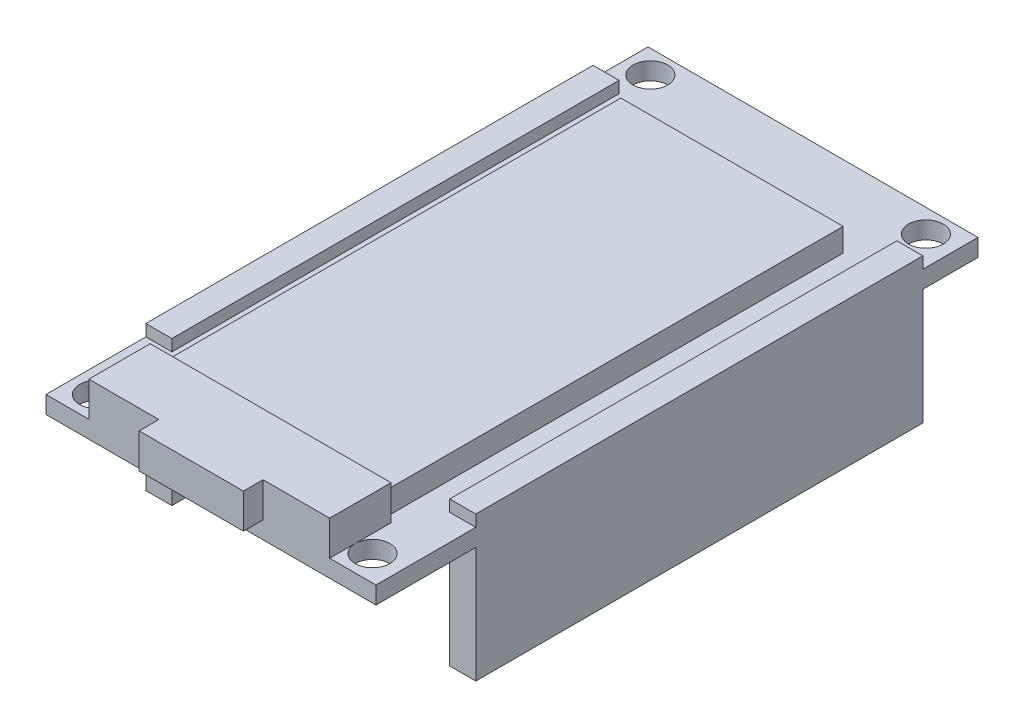
ISO-10303-21;
HEADER;
FILE_DESCRIPTION(('STEP AP214'),'2;1');
FILE_NAME('part.step','',(''),(''),'','','');
FILE_SCHEMA(('AUTOMOTIVE_DESIGN { 1 0 10303 214 1 1 1 1 }'));
ENDSEC;
DATA;
#1=APPLICATION_CONTEXT('core data for automotive mechanical design processes');
#2=APPLICATION_PROTOCOL_DEFINITION('international standard','automotive_design',2000,#1);
#3=PRODUCT_CONTEXT('',#1,'mechanical');
#4=PRODUCT('Part','Part','',(#3));
#5=PRODUCT_RELATED_PRODUCT_CATEGORY('part','',(#4));
#6=PRODUCT_DEFINITION_FORMATION('','',#4);
#7=PRODUCT_DEFINITION_CONTEXT('part definition',#1,'design');
#8=PRODUCT_DEFINITION('design','',#6,#7);
#9=PRODUCT_DEFINITION_SHAPE('','',#8);
#10=(LENGTH_UNIT() NAMED_UNIT(*) SI_UNIT(.MILLI.,.METRE.));
#11=(NAMED_UNIT(*) PLANE_ANGLE_UNIT() SI_UNIT($,.RADIAN.));
#12=(NAMED_UNIT(*) SI_UNIT($,.STERADIAN.) SOLID_ANGLE_UNIT());
#13=UNCERTAINTY_MEASURE_WITH_UNIT(LENGTH_MEASURE(1.E-05),#10,'distance_accuracy_value','');
#14=(GEOMETRIC_REPRESENTATION_CONTEXT(3) GLOBAL_UNCERTAINTY_ASSIGNED_CONTEXT((#13)) GLOBAL_UNIT_ASSIGNED_CONTEXT((#10,
#11,#12)) REPRESENTATION_CONTEXT('',''));
#15=CARTESIAN_POINT('',(0.,0.,0.));
#16=DIRECTION('',(0.,0.,1.));
#17=DIRECTION('',(1.,0.,0.));
#18=AXIS2_PLACEMENT_3D('',#15,#16,#17);
#19=CARTESIAN_POINT('',(0.,1.5,0.));
#20=DIRECTION('',(0.,1.,0.));
#21=DIRECTION('',(0.,0.,1.));
#22=AXIS2_PLACEMENT_3D('',#19,#20,#21);
#23=PLANE('',#22);
#24=DIRECTION('',(-1.,0.,0.));
#25=VECTOR('',#24,1.);
#26=CARTESIAN_POINT('',(2.25,1.5,43.3778084250648));
#27=LINE('',#26,#25);
#28=CARTESIAN_POINT('',(2.25,1.5,43.3778084250648));
#29=VERTEX_POINT('',#28);
#30=CARTESIAN_POINT('',(0.,1.5,43.3778084250648));
#31=VERTEX_POINT('',#30);
#32=EDGE_CURVE('E370',#29,#31,#27,.T.);
#33=ORIENTED_EDGE('',*,*,#32,.T.);
#34=DIRECTION('',(0.,0.,1.));
#35=VECTOR('',#34,1.);
#36=CARTESIAN_POINT('',(0.,1.5,0.));
#37=LINE('',#36,#35);
#38=CARTESIAN_POINT('',(0.,1.5,52.));
#39=VERTEX_POINT('',#38);
#40=EDGE_CURVE('E518',#31,#39,#37,.T.);
#41=ORIENTED_EDGE('',*,*,#40,.T.);
#42=DIRECTION('',(1.,0.,0.));
#43=VECTOR('',#42,1.);
#44=CARTESIAN_POINT('',(0.,1.5,52.));
#45=LINE('',#44,#43);
#46=CARTESIAN_POINT('',(3.7,1.5,52.));
#47=VERTEX_POINT('',#46);
#48=EDGE_CURVE('E533',#39,#47,#45,.T.);
#49=ORIENTED_EDGE('',*,*,#48,.T.);
#50=DIRECTION('',(0.,0.,1.));
#51=VECTOR('',#50,1.);
#52=CARTESIAN_POINT('',(3.7,1.5,46.7));
#53=LINE('',#52,#51);
#54=CARTESIAN_POINT('',(3.7,1.5,49.8));
#55=VERTEX_POINT('',#54);
#56=EDGE_CURVE('E453',#55,#47,#53,.T.);
#57=ORIENTED_EDGE('',*,*,#56,.F.);
#58=CARTESIAN_POINT('',(2.2,1.5,49.8));
#59=DIRECTION('',(0.,1.,0.));
#60=DIRECTION('',(0.,0.,-1.));
#61=AXIS2_PLACEMENT_3D('',#58,#59,#60);
#62=CIRCLE('',#61,1.5);
#63=EDGE_CURVE('E556',#55,#55,#62,.T.);
#64=ORIENTED_EDGE('',*,*,#63,.F.);
#65=CARTESIAN_POINT('',(3.7,1.5,46.7));
#66=VERTEX_POINT('',#65);
#67=EDGE_CURVE('E450',#66,#55,#53,.T.);
#68=ORIENTED_EDGE('',*,*,#67,.F.);
#69=DIRECTION('',(1.,0.,0.));
#70=VECTOR('',#69,1.);
#71=CARTESIAN_POINT('',(9.75,1.5,46.7));
#72=LINE('',#71,#70);
#73=CARTESIAN_POINT('',(4.65,1.5,46.7));
#74=VERTEX_POINT('',#73);
#75=EDGE_CURVE('E482',#66,#74,#72,.T.);
#76=ORIENTED_EDGE('',*,*,#75,.T.);
#77=DIRECTION('',(0.,0.,-1.));
#78=VECTOR('',#77,1.);
#79=CARTESIAN_POINT('',(4.65,1.5,46.7));
#80=LINE('',#79,#78);
#81=CARTESIAN_POINT('',(4.65,1.5,7.));
#82=VERTEX_POINT('',#81);
#83=EDGE_CURVE('E428',#74,#82,#80,.T.);
#84=ORIENTED_EDGE('',*,*,#83,.T.);
#85=DIRECTION('',(1.,0.,0.));
#86=VECTOR('',#85,1.);
#87=CARTESIAN_POINT('',(4.65,1.5,7.));
#88=LINE('',#87,#86);
#89=CARTESIAN_POINT('',(23.85,1.5,7.));
#90=VERTEX_POINT('',#89);
#91=EDGE_CURVE('E418',#82,#90,#88,.T.);
#92=ORIENTED_EDGE('',*,*,#91,.T.);
#93=DIRECTION('',(0.,0.,1.));
#94=VECTOR('',#93,1.);
#95=CARTESIAN_POINT('',(23.85,1.5,7.));
#96=LINE('',#95,#94);
#97=CARTESIAN_POINT('',(23.85,1.5,46.7));
#98=VERTEX_POINT('',#97);
#99=EDGE_CURVE('E413',#90,#98,#96,.T.);
#100=ORIENTED_EDGE('',*,*,#99,.T.);
#101=CARTESIAN_POINT('',(24.5,1.5,46.7));
#102=VERTEX_POINT('',#101);
#103=EDGE_CURVE('E486',#98,#102,#72,.T.);
#104=ORIENTED_EDGE('',*,*,#103,.T.);
#105=DIRECTION('',(0.,0.,-1.));
#106=VECTOR('',#105,1.);
#107=CARTESIAN_POINT('',(24.5,1.5,52.));
#108=LINE('',#107,#106);
#109=CARTESIAN_POINT('',(24.5,1.5,49.8));
#110=VERTEX_POINT('',#109);
#111=EDGE_CURVE('E452',#110,#102,#108,.T.);
#112=ORIENTED_EDGE('',*,*,#111,.F.);
#113=CARTESIAN_POINT('',(26.,1.5,49.8));
#114=DIRECTION('',(0.,1.,0.));
#115=DIRECTION('',(0.,0.,1.));
#116=AXIS2_PLACEMENT_3D('',#113,#114,#115);
#117=CIRCLE('',#116,1.5);
#118=EDGE_CURVE('E544',#110,#110,#117,.T.);
#119=ORIENTED_EDGE('',*,*,#118,.F.);
#120=CARTESIAN_POINT('',(24.5,1.5,52.));
#121=VERTEX_POINT('',#120);
#122=EDGE_CURVE('E461',#121,#110,#108,.T.);
#123=ORIENTED_EDGE('',*,*,#122,.F.);
#124=CARTESIAN_POINT('',(28.5,1.5,52.));
#125=VERTEX_POINT('',#124);
#126=EDGE_CURVE('E537',#121,#125,#45,.T.);
#127=ORIENTED_EDGE('',*,*,#126,.T.);
#128=DIRECTION('',(0.,0.,-1.));
#129=VECTOR('',#128,1.);
#130=CARTESIAN_POINT('',(28.5,1.5,0.));
#131=LINE('',#130,#129);
#132=CARTESIAN_POINT('',(28.5,1.5,43.3778084250648));
#133=VERTEX_POINT('',#132);
#134=EDGE_CURVE('E530',#125,#133,#131,.T.);
#135=ORIENTED_EDGE('',*,*,#134,.T.);
#136=DIRECTION('',(1.,0.,0.));
#137=VECTOR('',#136,1.);
#138=CARTESIAN_POINT('',(0.,1.5,43.3778084250648));
#139=LINE('',#138,#137);
#140=CARTESIAN_POINT('',(26.25,1.5,43.3778084250648));
#141=VERTEX_POINT('',#140);
#142=EDGE_CURVE('E388',#141,#133,#139,.T.);
#143=ORIENTED_EDGE('',*,*,#142,.F.);
#144=DIRECTION('',(0.,0.,1.));
#145=VECTOR('',#144,1.);
#146=CARTESIAN_POINT('',(26.25,1.5,0.));
#147=LINE('',#146,#145);
#148=CARTESIAN_POINT('',(26.25,1.5,4.75716758743066));
#149=VERTEX_POINT('',#148);
#150=EDGE_CURVE('E397',#149,#141,#147,.T.);
#151=ORIENTED_EDGE('',*,*,#150,.F.);
#152=DIRECTION('',(-1.,0.,0.));
#153=VECTOR('',#152,1.);
#154=CARTESIAN_POINT('',(0.,1.5,4.75716758743063));
#155=LINE('',#154,#153);
#156=CARTESIAN_POINT('',(28.5,1.5,4.75716758743066));
#157=VERTEX_POINT('',#156);
#158=EDGE_CURVE('E373',#157,#149,#155,.T.);
#159=ORIENTED_EDGE('',*,*,#158,.F.);
#160=CARTESIAN_POINT('',(28.5,1.5,0.));
#161=VERTEX_POINT('',#160);
#162=EDGE_CURVE('E532',#157,#161,#131,.T.);
#163=ORIENTED_EDGE('',*,*,#162,.T.);
#164=DIRECTION('',(-1.,0.,0.));
#165=VECTOR('',#164,1.);
#166=CARTESIAN_POINT('',(0.,1.5,0.));
#167=LINE('',#166,#165);
#168=CARTESIAN_POINT('',(0.,1.5,0.));
#169=VERTEX_POINT('',#168);
#170=EDGE_CURVE('E515',#161,#169,#167,.T.);
#171=ORIENTED_EDGE('',*,*,#170,.T.);
#172=CARTESIAN_POINT('',(0.,1.5,4.75716758743066));
#173=VERTEX_POINT('',#172);
#174=EDGE_CURVE('E538',#169,#173,#37,.T.);
#175=ORIENTED_EDGE('',*,*,#174,.T.);
#176=DIRECTION('',(1.,0.,0.));
#177=VECTOR('',#176,1.);
#178=CARTESIAN_POINT('',(0.,1.5,4.75716758743066));
#179=LINE('',#178,#177);
#180=CARTESIAN_POINT('',(2.25,1.5,4.75716758743066));
#181=VERTEX_POINT('',#180);
#182=EDGE_CURVE('E367',#173,#181,#179,.T.);
#183=ORIENTED_EDGE('',*,*,#182,.T.);
#184=DIRECTION('',(0.,0.,1.));
#185=VECTOR('',#184,1.);
#186=CARTESIAN_POINT('',(2.25,1.5,4.75716758743066));
#187=LINE('',#186,#185);
#188=EDGE_CURVE('E365',#181,#29,#187,.T.);
#189=ORIENTED_EDGE('',*,*,#188,.T.);
#190=EDGE_LOOP('',(#33,#41,#49,#57,#64,#68,#76,#84,#92,#100,#104,#112,#119,#123,#127,#135,#143,
#151,#159,#163,#171,#175,#183,#189));
#191=FACE_BOUND('',#190,.T.);
#192=CARTESIAN_POINT('',(2.2,1.5,2.));
#193=DIRECTION('',(0.,1.,0.));
#194=DIRECTION('',(0.,0.,1.));
#195=AXIS2_PLACEMENT_3D('',#192,#193,#194);
#196=CIRCLE('',#195,1.5);
#197=CARTESIAN_POINT('',(2.2,1.5,3.5));
#198=VERTEX_POINT('',#197);
#199=EDGE_CURVE('E550',#198,#198,#196,.T.);
#200=ORIENTED_EDGE('',*,*,#199,.F.);
#201=EDGE_LOOP('',(#200));
#202=FACE_BOUND('',#201,.T.);
#203=CARTESIAN_POINT('',(26.,1.5,2.));
#204=DIRECTION('',(0.,1.,0.));
#205=DIRECTION('',(0.,0.,1.));
#206=AXIS2_PLACEMENT_3D('',#203,#204,#205);
#207=CIRCLE('',#206,1.5);
#208=CARTESIAN_POINT('',(26.,1.5,3.5));
#209=VERTEX_POINT('',#208);
#210=EDGE_CURVE('E543',#209,#209,#207,.T.);
#211=ORIENTED_EDGE('',*,*,#210,.F.);
#212=EDGE_LOOP('',(#211));
#213=FACE_BOUND('',#212,.T.);
#214=ADVANCED_FACE('F78',(#191,#202,#213),#23,.T.);
#215=CARTESIAN_POINT('',(9.75,1.5,46.7));
#216=DIRECTION('',(1.,0.,0.));
#217=DIRECTION('',(0.,0.,-1.));
#218=AXIS2_PLACEMENT_3D('',#215,#216,#217);
#219=PLANE('',#218);
#220=DIRECTION('',(0.,-1.,0.));
#221=VECTOR('',#220,1.);
#222=CARTESIAN_POINT('',(9.75,4.5,52.));
#223=LINE('',#222,#221);
#224=CARTESIAN_POINT('',(9.75,4.5,52.));
#225=VERTEX_POINT('',#224);
#226=CARTESIAN_POINT('',(9.75,1.5,52.));
#227=VERTEX_POINT('',#226);
#228=EDGE_CURVE('E434',#225,#227,#223,.T.);
#229=ORIENTED_EDGE('',*,*,#228,.T.);
#230=DIRECTION('',(0.,0.,-1.));
#231=VECTOR('',#230,1.);
#232=CARTESIAN_POINT('',(9.75,1.5,46.7));
#233=LINE('',#232,#231);
#234=CARTESIAN_POINT('',(9.75,1.5,53.7));
#235=VERTEX_POINT('',#234);
#236=EDGE_CURVE('E475',#235,#227,#233,.T.);
#237=ORIENTED_EDGE('',*,*,#236,.F.);
#238=DIRECTION('',(0.,1.,0.));
#239=VECTOR('',#238,1.);
#240=CARTESIAN_POINT('',(9.75,1.5,53.7));
#241=LINE('',#240,#239);
#242=CARTESIAN_POINT('',(9.75,4.5,53.7));
#243=VERTEX_POINT('',#242);
#244=EDGE_CURVE('E479',#235,#243,#241,.T.);
#245=ORIENTED_EDGE('',*,*,#244,.T.);
#246=DIRECTION('',(0.,0.,-1.));
#247=VECTOR('',#246,1.);
#248=CARTESIAN_POINT('',(9.75,4.5,46.7));
#249=LINE('',#248,#247);
#250=EDGE_CURVE('E474',#243,#225,#249,.T.);
#251=ORIENTED_EDGE('',*,*,#250,.T.);
#252=EDGE_LOOP('',(#229,#237,#245,#251));
#253=FACE_BOUND('',#252,.T.);
#254=ADVANCED_FACE('F590',(#253),#219,.F.);
#255=CARTESIAN_POINT('',(18.75,1.5,46.7));
#256=DIRECTION('',(-1.,0.,0.));
#257=DIRECTION('',(0.,0.,1.));
#258=AXIS2_PLACEMENT_3D('',#255,#256,#257);
#259=PLANE('',#258);
#260=DIRECTION('',(0.,-1.,0.));
#261=VECTOR('',#260,1.);
#262=CARTESIAN_POINT('',(18.75,4.5,52.));
#263=LINE('',#262,#261);
#264=CARTESIAN_POINT('',(18.75,4.5,52.));
#265=VERTEX_POINT('',#264);
#266=CARTESIAN_POINT('',(18.75,1.5,52.));
#267=VERTEX_POINT('',#266);
#268=EDGE_CURVE('E468',#265,#267,#263,.T.);
#269=ORIENTED_EDGE('',*,*,#268,.F.);
#270=DIRECTION('',(0.,0.,1.));
#271=VECTOR('',#270,1.);
#272=CARTESIAN_POINT('',(18.75,4.5,46.7));
#273=LINE('',#272,#271);
#274=CARTESIAN_POINT('',(18.75,4.5,53.7));
#275=VERTEX_POINT('',#274);
#276=EDGE_CURVE('E495',#265,#275,#273,.T.);
#277=ORIENTED_EDGE('',*,*,#276,.T.);
#278=DIRECTION('',(0.,1.,0.));
#279=VECTOR('',#278,1.);
#280=CARTESIAN_POINT('',(18.75,1.5,53.7));
#281=LINE('',#280,#279);
#282=CARTESIAN_POINT('',(18.75,1.5,53.7));
#283=VERTEX_POINT('',#282);
#284=EDGE_CURVE('E572',#283,#275,#281,.T.);
#285=ORIENTED_EDGE('',*,*,#284,.F.);
#286=DIRECTION('',(0.,0.,1.));
#287=VECTOR('',#286,1.);
#288=CARTESIAN_POINT('',(18.75,1.5,46.7));
#289=LINE('',#288,#287);
#290=EDGE_CURVE('E563',#267,#283,#289,.T.);
#291=ORIENTED_EDGE('',*,*,#290,.F.);
#292=EDGE_LOOP('',(#269,#277,#285,#291));
#293=FACE_BOUND('',#292,.T.);
#294=ADVANCED_FACE('F686',(#293),#259,.F.);
#295=CARTESIAN_POINT('',(0.,0.,0.));
#296=DIRECTION('',(0.,1.,0.));
#297=DIRECTION('',(0.,0.,1.));
#298=AXIS2_PLACEMENT_3D('',#295,#296,#297);
#299=PLANE('',#298);
#300=DIRECTION('',(0.,0.,-1.));
#301=VECTOR('',#300,1.);
#302=CARTESIAN_POINT('',(28.5,0.,0.));
#303=LINE('',#302,#301);
#304=CARTESIAN_POINT('',(28.5,0.,4.75716758743066));
#305=VERTEX_POINT('',#304);
#306=CARTESIAN_POINT('',(28.5,0.,0.));
#307=VERTEX_POINT('',#306);
#308=EDGE_CURVE('E522',#305,#307,#303,.T.);
#309=ORIENTED_EDGE('',*,*,#308,.F.);
#310=DIRECTION('',(-1.,0.,0.));
#311=VECTOR('',#310,1.);
#312=CARTESIAN_POINT('',(0.,0.,4.75716758743063));
#313=LINE('',#312,#311);
#314=CARTESIAN_POINT('',(26.25,0.,4.75716758743066));
#315=VERTEX_POINT('',#314);
#316=EDGE_CURVE('E323',#305,#315,#313,.T.);
#317=ORIENTED_EDGE('',*,*,#316,.T.);
#318=DIRECTION('',(0.,0.,1.));
#319=VECTOR('',#318,1.);
#320=CARTESIAN_POINT('',(26.25,0.,0.));
#321=LINE('',#320,#319);
#322=CARTESIAN_POINT('',(26.25,0.,43.3778084250648));
#323=VERTEX_POINT('',#322);
#324=EDGE_CURVE('E12',#315,#323,#321,.T.);
#325=ORIENTED_EDGE('',*,*,#324,.T.);
#326=DIRECTION('',(1.,0.,0.));
#327=VECTOR('',#326,1.);
#328=CARTESIAN_POINT('',(0.,0.,43.3778084250648));
#329=LINE('',#328,#327);
#330=CARTESIAN_POINT('',(28.5,0.,43.3778084250648));
#331=VERTEX_POINT('',#330);
#332=EDGE_CURVE('E295',#323,#331,#329,.T.);
#333=ORIENTED_EDGE('',*,*,#332,.T.);
#334=CARTESIAN_POINT('',(28.5,0.,52.));
#335=VERTEX_POINT('',#334);
#336=EDGE_CURVE('E519',#335,#331,#303,.T.);
#337=ORIENTED_EDGE('',*,*,#336,.F.);
#338=DIRECTION('',(1.,0.,0.));
#339=VECTOR('',#338,1.);
#340=CARTESIAN_POINT('',(0.,0.,52.));
#341=LINE('',#340,#339);
#342=CARTESIAN_POINT('',(0.,0.,52.));
#343=VERTEX_POINT('',#342);
#344=EDGE_CURVE('E523',#343,#335,#341,.T.);
#345=ORIENTED_EDGE('',*,*,#344,.F.);
#346=DIRECTION('',(0.,0.,1.));
#347=VECTOR('',#346,1.);
#348=CARTESIAN_POINT('',(0.,0.,0.));
#349=LINE('',#348,#347);
#350=CARTESIAN_POINT('',(0.,0.,43.3778084250648));
#351=VERTEX_POINT('',#350);
#352=EDGE_CURVE('E528',#351,#343,#349,.T.);
#353=ORIENTED_EDGE('',*,*,#352,.F.);
#354=DIRECTION('',(1.,0.,0.));
#355=VECTOR('',#354,1.);
#356=CARTESIAN_POINT('',(0.,0.,43.3778084250648));
#357=LINE('',#356,#355);
#358=CARTESIAN_POINT('',(2.25,0.,43.3778084250648));
#359=VERTEX_POINT('',#358);
#360=EDGE_CURVE('E340',#351,#359,#357,.T.);
#361=ORIENTED_EDGE('',*,*,#360,.T.);
#362=DIRECTION('',(0.,0.,-1.));
#363=VECTOR('',#362,1.);
#364=CARTESIAN_POINT('',(2.25,0.,0.));
#365=LINE('',#364,#363);
#366=CARTESIAN_POINT('',(2.25,0.,4.75716758743066));
#367=VERTEX_POINT('',#366);
#368=EDGE_CURVE('E86',#359,#367,#365,.T.);
#369=ORIENTED_EDGE('',*,*,#368,.T.);
#370=DIRECTION('',(-1.,0.,0.));
#371=VECTOR('',#370,1.);
#372=CARTESIAN_POINT('',(0.,0.,4.75716758743066));
#373=LINE('',#372,#371);
#374=CARTESIAN_POINT('',(0.,0.,4.75716758743066));
#375=VERTEX_POINT('',#374);
#376=EDGE_CURVE('E349',#367,#375,#373,.T.);
#377=ORIENTED_EDGE('',*,*,#376,.T.);
#378=CARTESIAN_POINT('',(0.,0.,0.));
#379=VERTEX_POINT('',#378);
#380=EDGE_CURVE('E525',#379,#375,#349,.T.);
#381=ORIENTED_EDGE('',*,*,#380,.F.);
#382=DIRECTION('',(-1.,0.,0.));
#383=VECTOR('',#382,1.);
#384=CARTESIAN_POINT('',(0.,0.,0.));
#385=LINE('',#384,#383);
#386=EDGE_CURVE('E516',#307,#379,#385,.T.);
#387=ORIENTED_EDGE('',*,*,#386,.F.);
#388=EDGE_LOOP('',(#309,#317,#325,#333,#337,#345,#353,#361,#369,#377,#381,#387));
#389=FACE_BOUND('',#388,.T.);
#390=CARTESIAN_POINT('',(26.,0.,2.));
#391=DIRECTION('',(0.,1.,0.));
#392=DIRECTION('',(0.,0.,1.));
#393=AXIS2_PLACEMENT_3D('',#390,#391,#392);
#394=CIRCLE('',#393,1.5);
#395=CARTESIAN_POINT('',(26.,0.,3.5));
#396=VERTEX_POINT('',#395);
#397=EDGE_CURVE('E540',#396,#396,#394,.T.);
#398=ORIENTED_EDGE('',*,*,#397,.T.);
#399=EDGE_LOOP('',(#398));
#400=FACE_BOUND('',#399,.T.);
#401=CARTESIAN_POINT('',(26.,0.,49.8));
#402=DIRECTION('',(0.,1.,0.));
#403=DIRECTION('',(0.,0.,1.));
#404=AXIS2_PLACEMENT_3D('',#401,#402,#403);
#405=CIRCLE('',#404,1.5);
#406=CARTESIAN_POINT('',(26.,0.,51.3));
#407=VERTEX_POINT('',#406);
#408=EDGE_CURVE('E547',#407,#407,#405,.T.);
#409=ORIENTED_EDGE('',*,*,#408,.T.);
#410=EDGE_LOOP('',(#409));
#411=FACE_BOUND('',#410,.T.);
#412=CARTESIAN_POINT('',(2.2,0.,2.));
#413=DIRECTION('',(0.,1.,0.));
#414=DIRECTION('',(0.,0.,1.));
#415=AXIS2_PLACEMENT_3D('',#412,#413,#414);
#416=CIRCLE('',#415,1.5);
#417=CARTESIAN_POINT('',(2.2,0.,3.5));
#418=VERTEX_POINT('',#417);
#419=EDGE_CURVE('E553',#418,#418,#416,.T.);
#420=ORIENTED_EDGE('',*,*,#419,.T.);
#421=EDGE_LOOP('',(#420));
#422=FACE_BOUND('',#421,.T.);
#423=CARTESIAN_POINT('',(2.2,0.,49.8));
#424=DIRECTION('',(0.,1.,0.));
#425=DIRECTION('',(0.,0.,-1.));
#426=AXIS2_PLACEMENT_3D('',#423,#424,#425);
#427=CIRCLE('',#426,1.5);
#428=CARTESIAN_POINT('',(2.2,0.,48.3));
#429=VERTEX_POINT('',#428);
#430=EDGE_CURVE('E485',#429,#429,#427,.T.);
#431=ORIENTED_EDGE('',*,*,#430,.T.);
#432=EDGE_LOOP('',(#431));
#433=FACE_BOUND('',#432,.T.);
#434=ADVANCED_FACE('F654',(#389,#400,#411,#422,#433),#299,.F.);
#435=CARTESIAN_POINT('',(0.,1.5,0.));
#436=DIRECTION('',(1.,0.,0.));
#437=DIRECTION('',(0.,0.,-1.));
#438=AXIS2_PLACEMENT_3D('',#435,#436,#437);
#439=PLANE('',#438);
#440=ORIENTED_EDGE('',*,*,#40,.F.);
#441=DIRECTION('',(0.,-1.,0.));
#442=VECTOR('',#441,1.);
#443=CARTESIAN_POINT('',(0.,2.5,43.3778084250648));
#444=LINE('',#443,#442);
#445=CARTESIAN_POINT('',(0.,2.5,43.3778084250648));
#446=VERTEX_POINT('',#445);
#447=EDGE_CURVE('E353',#446,#31,#444,.T.);
#448=ORIENTED_EDGE('',*,*,#447,.F.);
#449=DIRECTION('',(0.,0.,-1.));
#450=VECTOR('',#449,1.);
#451=CARTESIAN_POINT('',(0.,2.5,43.3778084250648));
#452=LINE('',#451,#450);
#453=CARTESIAN_POINT('',(0.,2.5,4.75716758743066));
#454=VERTEX_POINT('',#453);
#455=EDGE_CURVE('E379',#446,#454,#452,.T.);
#456=ORIENTED_EDGE('',*,*,#455,.T.);
#457=DIRECTION('',(0.,-1.,0.));
#458=VECTOR('',#457,1.);
#459=CARTESIAN_POINT('',(0.,2.5,4.75716758743066));
#460=LINE('',#459,#458);
#461=EDGE_CURVE('E357',#454,#173,#460,.T.);
#462=ORIENTED_EDGE('',*,*,#461,.T.);
#463=ORIENTED_EDGE('',*,*,#174,.F.);
#464=DIRECTION('',(0.,-1.,0.));
#465=VECTOR('',#464,1.);
#466=CARTESIAN_POINT('',(0.,1.5,0.));
#467=LINE('',#466,#465);
#468=EDGE_CURVE('E512',#169,#379,#467,.T.);
#469=ORIENTED_EDGE('',*,*,#468,.T.);
#470=ORIENTED_EDGE('',*,*,#380,.T.);
#471=DIRECTION('',(0.,1.,0.));
#472=VECTOR('',#471,1.);
#473=CARTESIAN_POINT('',(0.,-10.,4.75716758743066));
#474=LINE('',#473,#472);
#475=CARTESIAN_POINT('',(0.,-10.,4.75716758743066));
#476=VERTEX_POINT('',#475);
#477=EDGE_CURVE('E338',#476,#375,#474,.T.);
#478=ORIENTED_EDGE('',*,*,#477,.F.);
#479=DIRECTION('',(0.,0.,1.));
#480=VECTOR('',#479,1.);
#481=CARTESIAN_POINT('',(0.,-10.,43.3778084250648));
#482=LINE('',#481,#480);
#483=CARTESIAN_POINT('',(0.,-10.,43.3778084250648));
#484=VERTEX_POINT('',#483);
#485=EDGE_CURVE('E326',#476,#484,#482,.T.);
#486=ORIENTED_EDGE('',*,*,#485,.T.);
#487=DIRECTION('',(0.,1.,0.));
#488=VECTOR('',#487,1.);
#489=CARTESIAN_POINT('',(0.,-10.,43.3778084250648));
#490=LINE('',#489,#488);
#491=EDGE_CURVE('E337',#484,#351,#490,.T.);
#492=ORIENTED_EDGE('',*,*,#491,.T.);
#493=ORIENTED_EDGE('',*,*,#352,.T.);
#494=DIRECTION('',(0.,-1.,0.));
#495=VECTOR('',#494,1.);
#496=CARTESIAN_POINT('',(0.,1.5,52.));
#497=LINE('',#496,#495);
#498=EDGE_CURVE('E499',#39,#343,#497,.T.);
#499=ORIENTED_EDGE('',*,*,#498,.F.);
#500=EDGE_LOOP('',(#440,#448,#456,#462,#463,#469,#470,#478,#486,#492,#493,#499));
#501=FACE_BOUND('',#500,.T.);
#502=ADVANCED_FACE('F80',(#501),#439,.F.);
#503=CARTESIAN_POINT('',(0.,1.5,52.));
#504=DIRECTION('',(0.,0.,-1.));
#505=DIRECTION('',(-1.,0.,0.));
#506=AXIS2_PLACEMENT_3D('',#503,#504,#505);
#507=PLANE('',#506);
#508=ORIENTED_EDGE('',*,*,#344,.T.);
#509=DIRECTION('',(0.,-1.,0.));
#510=VECTOR('',#509,1.);
#511=CARTESIAN_POINT('',(28.5,1.5,52.));
#512=LINE('',#511,#510);
#513=EDGE_CURVE('E502',#125,#335,#512,.T.);
#514=ORIENTED_EDGE('',*,*,#513,.F.);
#515=ORIENTED_EDGE('',*,*,#126,.F.);
#516=DIRECTION('',(0.,-1.,0.));
#517=VECTOR('',#516,1.);
#518=CARTESIAN_POINT('',(24.5,4.5,52.));
#519=LINE('',#518,#517);
#520=CARTESIAN_POINT('',(24.5,4.5,52.));
#521=VERTEX_POINT('',#520);
#522=EDGE_CURVE('E463',#521,#121,#519,.T.);
#523=ORIENTED_EDGE('',*,*,#522,.F.);
#524=DIRECTION('',(1.,0.,0.));
#525=VECTOR('',#524,1.);
#526=CARTESIAN_POINT('',(18.75,4.5,52.));
#527=LINE('',#526,#525);
#528=EDGE_CURVE('E460',#265,#521,#527,.T.);
#529=ORIENTED_EDGE('',*,*,#528,.F.);
#530=ORIENTED_EDGE('',*,*,#268,.T.);
#531=EDGE_CURVE('E536',#227,#267,#45,.T.);
#532=ORIENTED_EDGE('',*,*,#531,.F.);
#533=ORIENTED_EDGE('',*,*,#228,.F.);
#534=DIRECTION('',(1.,0.,0.));
#535=VECTOR('',#534,1.);
#536=CARTESIAN_POINT('',(3.7,4.5,52.));
#537=LINE('',#536,#535);
#538=CARTESIAN_POINT('',(3.7,4.5,52.));
#539=VERTEX_POINT('',#538);
#540=EDGE_CURVE('E455',#539,#225,#537,.T.);
#541=ORIENTED_EDGE('',*,*,#540,.F.);
#542=DIRECTION('',(0.,-1.,0.));
#543=VECTOR('',#542,1.);
#544=CARTESIAN_POINT('',(3.7,4.5,52.));
#545=LINE('',#544,#543);
#546=EDGE_CURVE('E446',#539,#47,#545,.T.);
#547=ORIENTED_EDGE('',*,*,#546,.T.);
#548=ORIENTED_EDGE('',*,*,#48,.F.);
#549=ORIENTED_EDGE('',*,*,#498,.T.);
#550=EDGE_LOOP('',(#508,#514,#515,#523,#529,#530,#532,#533,#541,#547,#548,#549));
#551=FACE_BOUND('',#550,.T.);
#552=ADVANCED_FACE('F601',(#551),#507,.F.);
#553=CARTESIAN_POINT('',(28.5,1.5,0.));
#554=DIRECTION('',(-1.,0.,0.));
#555=DIRECTION('',(0.,0.,1.));
#556=AXIS2_PLACEMENT_3D('',#553,#554,#555);
#557=PLANE('',#556);
#558=DIRECTION('',(0.,-1.,0.));
#559=VECTOR('',#558,1.);
#560=CARTESIAN_POINT('',(28.5,2.5,43.3778084250648));
#561=LINE('',#560,#559);
#562=CARTESIAN_POINT('',(28.5,2.5,43.3778084250648));
#563=VERTEX_POINT('',#562);
#564=EDGE_CURVE('E394',#563,#133,#561,.T.);
#565=ORIENTED_EDGE('',*,*,#564,.T.);
#566=ORIENTED_EDGE('',*,*,#134,.F.);
#567=ORIENTED_EDGE('',*,*,#513,.T.);
#568=ORIENTED_EDGE('',*,*,#336,.T.);
#569=DIRECTION('',(0.,1.,0.));
#570=VECTOR('',#569,1.);
#571=CARTESIAN_POINT('',(28.5,-10.,43.3778084250648));
#572=LINE('',#571,#570);
#573=CARTESIAN_POINT('',(28.5,-10.,43.3778084250648));
#574=VERTEX_POINT('',#573);
#575=EDGE_CURVE('E93',#574,#331,#572,.T.);
#576=ORIENTED_EDGE('',*,*,#575,.F.);
#577=DIRECTION('',(0.,0.,-1.));
#578=VECTOR('',#577,1.);
#579=CARTESIAN_POINT('',(28.5,-10.,43.3778084250648));
#580=LINE('',#579,#578);
#581=CARTESIAN_POINT('',(28.5,-10.,4.75716758743066));
#582=VERTEX_POINT('',#581);
#583=EDGE_CURVE('E308',#574,#582,#580,.T.);
#584=ORIENTED_EDGE('',*,*,#583,.T.);
#585=DIRECTION('',(0.,1.,0.));
#586=VECTOR('',#585,1.);
#587=CARTESIAN_POINT('',(28.5,-10.,4.75716758743066));
#588=LINE('',#587,#586);
#589=EDGE_CURVE('E318',#582,#305,#588,.T.);
#590=ORIENTED_EDGE('',*,*,#589,.T.);
#591=ORIENTED_EDGE('',*,*,#308,.T.);
#592=DIRECTION('',(0.,-1.,0.));
#593=VECTOR('',#592,1.);
#594=CARTESIAN_POINT('',(28.5,1.5,0.));
#595=LINE('',#594,#593);
#596=EDGE_CURVE('E507',#161,#307,#595,.T.);
#597=ORIENTED_EDGE('',*,*,#596,.F.);
#598=ORIENTED_EDGE('',*,*,#162,.F.);
#599=DIRECTION('',(0.,-1.,0.));
#600=VECTOR('',#599,1.);
#601=CARTESIAN_POINT('',(28.5,2.5,4.75716758743066));
#602=LINE('',#601,#600);
#603=CARTESIAN_POINT('',(28.5,2.5,4.75716758743066));
#604=VERTEX_POINT('',#603);
#605=EDGE_CURVE('E410',#604,#157,#602,.T.);
#606=ORIENTED_EDGE('',*,*,#605,.F.);
#607=DIRECTION('',(0.,0.,-1.));
#608=VECTOR('',#607,1.);
#609=CARTESIAN_POINT('',(28.5,2.5,0.));
#610=LINE('',#609,#608);
#611=EDGE_CURVE('E384',#563,#604,#610,.T.);
#612=ORIENTED_EDGE('',*,*,#611,.F.);
#613=EDGE_LOOP('',(#565,#566,#567,#568,#576,#584,#590,#591,#597,#598,#606,#612));
#614=FACE_BOUND('',#613,.T.);
#615=ADVANCED_FACE('F615',(#614),#557,.F.);
#616=CARTESIAN_POINT('',(0.,1.5,0.));
#617=DIRECTION('',(0.,0.,1.));
#618=DIRECTION('',(1.,0.,0.));
#619=AXIS2_PLACEMENT_3D('',#616,#617,#618);
#620=PLANE('',#619);
#621=ORIENTED_EDGE('',*,*,#386,.T.);
#622=ORIENTED_EDGE('',*,*,#468,.F.);
#623=ORIENTED_EDGE('',*,*,#170,.F.);
#624=ORIENTED_EDGE('',*,*,#596,.T.);
#625=EDGE_LOOP('',(#621,#622,#623,#624));
#626=FACE_BOUND('',#625,.T.);
#627=ADVANCED_FACE('F636',(#626),#620,.F.);
#628=CARTESIAN_POINT('',(26.,1.5,2.));
#629=DIRECTION('',(0.,-1.,0.));
#630=DIRECTION('',(0.,0.,-1.));
#631=AXIS2_PLACEMENT_3D('',#628,#629,#630);
#632=CYLINDRICAL_SURFACE('',#631,1.5);
#633=ORIENTED_EDGE('',*,*,#210,.T.);
#634=EDGE_LOOP('',(#633));
#635=FACE_BOUND('',#634,.T.);
#636=ORIENTED_EDGE('',*,*,#397,.F.);
#637=EDGE_LOOP('',(#636));
#638=FACE_BOUND('',#637,.T.);
#639=ADVANCED_FACE('F690',(#635,#638),#632,.F.);
#640=CARTESIAN_POINT('',(26.,1.5,49.8));
#641=DIRECTION('',(0.,-1.,0.));
#642=DIRECTION('',(0.,0.,-1.));
#643=AXIS2_PLACEMENT_3D('',#640,#641,#642);
#644=CYLINDRICAL_SURFACE('',#643,1.5);
#645=ORIENTED_EDGE('',*,*,#118,.T.);
#646=EDGE_LOOP('',(#645));
#647=FACE_BOUND('',#646,.T.);
#648=ORIENTED_EDGE('',*,*,#408,.F.);
#649=EDGE_LOOP('',(#648));
#650=FACE_BOUND('',#649,.T.);
#651=ADVANCED_FACE('F951',(#647,#650),#644,.F.);
#652=CARTESIAN_POINT('',(2.2,1.5,2.));
#653=DIRECTION('',(0.,-1.,0.));
#654=DIRECTION('',(0.,0.,-1.));
#655=AXIS2_PLACEMENT_3D('',#652,#653,#654);
#656=CYLINDRICAL_SURFACE('',#655,1.5);
#657=ORIENTED_EDGE('',*,*,#199,.T.);
#658=EDGE_LOOP('',(#657));
#659=FACE_BOUND('',#658,.T.);
#660=ORIENTED_EDGE('',*,*,#419,.F.);
#661=EDGE_LOOP('',(#660));
#662=FACE_BOUND('',#661,.T.);
#663=ADVANCED_FACE('F942',(#659,#662),#656,.F.);
#664=CARTESIAN_POINT('',(2.2,1.5,49.8));
#665=DIRECTION('',(0.,-1.,0.));
#666=DIRECTION('',(0.,0.,-1.));
#667=AXIS2_PLACEMENT_3D('',#664,#665,#666);
#668=CYLINDRICAL_SURFACE('',#667,1.5);
#669=ORIENTED_EDGE('',*,*,#63,.T.);
#670=EDGE_LOOP('',(#669));
#671=FACE_BOUND('',#670,.T.);
#672=ORIENTED_EDGE('',*,*,#430,.F.);
#673=EDGE_LOOP('',(#672));
#674=FACE_BOUND('',#673,.T.);
#675=ADVANCED_FACE('F911',(#671,#674),#668,.F.);
#676=CARTESIAN_POINT('',(0.,4.5,0.));
#677=DIRECTION('',(0.,-1.,0.));
#678=DIRECTION('',(0.,0.,-1.));
#679=AXIS2_PLACEMENT_3D('',#676,#677,#678);
#680=PLANE('',#679);
#681=ORIENTED_EDGE('',*,*,#250,.F.);
#682=DIRECTION('',(-1.,0.,0.));
#683=VECTOR('',#682,1.);
#684=CARTESIAN_POINT('',(9.75,4.5,53.7));
#685=LINE('',#684,#683);
#686=EDGE_CURVE('E478',#275,#243,#685,.T.);
#687=ORIENTED_EDGE('',*,*,#686,.F.);
#688=ORIENTED_EDGE('',*,*,#276,.F.);
#689=ORIENTED_EDGE('',*,*,#528,.T.);
#690=DIRECTION('',(0.,0.,-1.));
#691=VECTOR('',#690,1.);
#692=CARTESIAN_POINT('',(24.5,4.5,52.));
#693=LINE('',#692,#691);
#694=CARTESIAN_POINT('',(24.5,4.5,46.7));
#695=VERTEX_POINT('',#694);
#696=EDGE_CURVE('E457',#521,#695,#693,.T.);
#697=ORIENTED_EDGE('',*,*,#696,.T.);
#698=DIRECTION('',(1.,0.,0.));
#699=VECTOR('',#698,1.);
#700=CARTESIAN_POINT('',(9.75,4.5,46.7));
#701=LINE('',#700,#699);
#702=CARTESIAN_POINT('',(3.7,4.5,46.7));
#703=VERTEX_POINT('',#702);
#704=EDGE_CURVE('E494',#703,#695,#701,.T.);
#705=ORIENTED_EDGE('',*,*,#704,.F.);
#706=DIRECTION('',(0.,0.,1.));
#707=VECTOR('',#706,1.);
#708=CARTESIAN_POINT('',(3.7,4.5,46.7));
#709=LINE('',#708,#707);
#710=EDGE_CURVE('E449',#703,#539,#709,.T.);
#711=ORIENTED_EDGE('',*,*,#710,.T.);
#712=ORIENTED_EDGE('',*,*,#540,.T.);
#713=EDGE_LOOP('',(#681,#687,#688,#689,#697,#705,#711,#712));
#714=FACE_BOUND('',#713,.T.);
#715=ADVANCED_FACE('F595',(#714),#680,.F.);
#716=CARTESIAN_POINT('',(0.,1.5,0.));
#717=DIRECTION('',(0.,-1.,0.));
#718=DIRECTION('',(0.,0.,-1.));
#719=AXIS2_PLACEMENT_3D('',#716,#717,#718);
#720=PLANE('',#719);
#721=ORIENTED_EDGE('',*,*,#236,.T.);
#722=ORIENTED_EDGE('',*,*,#531,.T.);
#723=ORIENTED_EDGE('',*,*,#290,.T.);
#724=DIRECTION('',(-1.,0.,0.));
#725=VECTOR('',#724,1.);
#726=CARTESIAN_POINT('',(9.75,1.5,53.7));
#727=LINE('',#726,#725);
#728=EDGE_CURVE('E575',#283,#235,#727,.T.);
#729=ORIENTED_EDGE('',*,*,#728,.T.);
#730=EDGE_LOOP('',(#721,#722,#723,#729));
#731=FACE_BOUND('',#730,.T.);
#732=ADVANCED_FACE('F918',(#731),#720,.T.);
#733=CARTESIAN_POINT('',(9.75,1.5,53.7));
#734=DIRECTION('',(0.,0.,-1.));
#735=DIRECTION('',(-1.,0.,0.));
#736=AXIS2_PLACEMENT_3D('',#733,#734,#735);
#737=PLANE('',#736);
#738=ORIENTED_EDGE('',*,*,#686,.T.);
#739=ORIENTED_EDGE('',*,*,#244,.F.);
#740=ORIENTED_EDGE('',*,*,#728,.F.);
#741=ORIENTED_EDGE('',*,*,#284,.T.);
#742=EDGE_LOOP('',(#738,#739,#740,#741));
#743=FACE_BOUND('',#742,.T.);
#744=ADVANCED_FACE('F908',(#743),#737,.F.);
#745=CARTESIAN_POINT('',(9.75,1.5,46.7));
#746=DIRECTION('',(0.,0.,1.));
#747=DIRECTION('',(1.,0.,0.));
#748=AXIS2_PLACEMENT_3D('',#745,#746,#747);
#749=PLANE('',#748);
#750=ORIENTED_EDGE('',*,*,#103,.F.);
#751=DIRECTION('',(0.,-1.,0.));
#752=VECTOR('',#751,1.);
#753=CARTESIAN_POINT('',(23.85,3.5,46.7));
#754=LINE('',#753,#752);
#755=CARTESIAN_POINT('',(23.85,3.5,46.7));
#756=VERTEX_POINT('',#755);
#757=EDGE_CURVE('E426',#756,#98,#754,.T.);
#758=ORIENTED_EDGE('',*,*,#757,.F.);
#759=DIRECTION('',(-1.,0.,0.));
#760=VECTOR('',#759,1.);
#761=CARTESIAN_POINT('',(23.85,3.5,46.7));
#762=LINE('',#761,#760);
#763=CARTESIAN_POINT('',(4.65,3.5,46.7));
#764=VERTEX_POINT('',#763);
#765=EDGE_CURVE('E417',#756,#764,#762,.T.);
#766=ORIENTED_EDGE('',*,*,#765,.T.);
#767=DIRECTION('',(0.,-1.,0.));
#768=VECTOR('',#767,1.);
#769=CARTESIAN_POINT('',(4.65,3.5,46.7));
#770=LINE('',#769,#768);
#771=EDGE_CURVE('E438',#764,#74,#770,.T.);
#772=ORIENTED_EDGE('',*,*,#771,.T.);
#773=ORIENTED_EDGE('',*,*,#75,.F.);
#774=DIRECTION('',(0.,-1.,0.));
#775=VECTOR('',#774,1.);
#776=CARTESIAN_POINT('',(3.7,4.5,46.7));
#777=LINE('',#776,#775);
#778=EDGE_CURVE('E443',#703,#66,#777,.T.);
#779=ORIENTED_EDGE('',*,*,#778,.F.);
#780=ORIENTED_EDGE('',*,*,#704,.T.);
#781=DIRECTION('',(0.,-1.,0.));
#782=VECTOR('',#781,1.);
#783=CARTESIAN_POINT('',(24.5,4.5,46.7));
#784=LINE('',#783,#782);
#785=EDGE_CURVE('E471',#695,#102,#784,.T.);
#786=ORIENTED_EDGE('',*,*,#785,.T.);
#787=EDGE_LOOP('',(#750,#758,#766,#772,#773,#779,#780,#786));
#788=FACE_BOUND('',#787,.T.);
#789=ADVANCED_FACE('F882',(#788),#749,.F.);
#790=CARTESIAN_POINT('',(24.5,4.5,52.));
#791=DIRECTION('',(-1.,0.,0.));
#792=DIRECTION('',(0.,0.,1.));
#793=AXIS2_PLACEMENT_3D('',#790,#791,#792);
#794=PLANE('',#793);
#795=ORIENTED_EDGE('',*,*,#122,.T.);
#796=ORIENTED_EDGE('',*,*,#111,.T.);
#797=ORIENTED_EDGE('',*,*,#785,.F.);
#798=ORIENTED_EDGE('',*,*,#696,.F.);
#799=ORIENTED_EDGE('',*,*,#522,.T.);
#800=EDGE_LOOP('',(#795,#796,#797,#798,#799));
#801=FACE_BOUND('',#800,.T.);
#802=ADVANCED_FACE('F873',(#801),#794,.F.);
#803=CARTESIAN_POINT('',(3.7,4.5,46.7));
#804=DIRECTION('',(1.,0.,0.));
#805=DIRECTION('',(0.,0.,-1.));
#806=AXIS2_PLACEMENT_3D('',#803,#804,#805);
#807=PLANE('',#806);
#808=ORIENTED_EDGE('',*,*,#67,.T.);
#809=ORIENTED_EDGE('',*,*,#56,.T.);
#810=ORIENTED_EDGE('',*,*,#546,.F.);
#811=ORIENTED_EDGE('',*,*,#710,.F.);
#812=ORIENTED_EDGE('',*,*,#778,.T.);
#813=EDGE_LOOP('',(#808,#809,#810,#811,#812));
#814=FACE_BOUND('',#813,.T.);
#815=ADVANCED_FACE('F864',(#814),#807,.F.);
#816=CARTESIAN_POINT('',(23.85,3.5,7.));
#817=DIRECTION('',(1.,0.,0.));
#818=DIRECTION('',(0.,0.,-1.));
#819=AXIS2_PLACEMENT_3D('',#816,#817,#818);
#820=PLANE('',#819);
#821=ORIENTED_EDGE('',*,*,#99,.F.);
#822=DIRECTION('',(0.,-1.,0.));
#823=VECTOR('',#822,1.);
#824=CARTESIAN_POINT('',(23.85,3.5,7.));
#825=LINE('',#824,#823);
#826=CARTESIAN_POINT('',(23.85,3.5,7.));
#827=VERTEX_POINT('',#826);
#828=EDGE_CURVE('E431',#827,#90,#825,.T.);
#829=ORIENTED_EDGE('',*,*,#828,.F.);
#830=DIRECTION('',(0.,0.,1.));
#831=VECTOR('',#830,1.);
#832=CARTESIAN_POINT('',(23.85,3.5,7.));
#833=LINE('',#832,#831);
#834=EDGE_CURVE('E414',#827,#756,#833,.T.);
#835=ORIENTED_EDGE('',*,*,#834,.T.);
#836=ORIENTED_EDGE('',*,*,#757,.T.);
#837=EDGE_LOOP('',(#821,#829,#835,#836));
#838=FACE_BOUND('',#837,.T.);
#839=ADVANCED_FACE('F855',(#838),#820,.T.);
#840=CARTESIAN_POINT('',(4.65,3.5,7.));
#841=DIRECTION('',(0.,0.,-1.));
#842=DIRECTION('',(-1.,0.,0.));
#843=AXIS2_PLACEMENT_3D('',#840,#841,#842);
#844=PLANE('',#843);
#845=ORIENTED_EDGE('',*,*,#91,.F.);
#846=DIRECTION('',(0.,-1.,0.));
#847=VECTOR('',#846,1.);
#848=CARTESIAN_POINT('',(4.65,3.5,7.));
#849=LINE('',#848,#847);
#850=CARTESIAN_POINT('',(4.65,3.5,7.));
#851=VERTEX_POINT('',#850);
#852=EDGE_CURVE('E435',#851,#82,#849,.T.);
#853=ORIENTED_EDGE('',*,*,#852,.F.);
#854=DIRECTION('',(1.,0.,0.));
#855=VECTOR('',#854,1.);
#856=CARTESIAN_POINT('',(4.65,3.5,7.));
#857=LINE('',#856,#855);
#858=EDGE_CURVE('E423',#851,#827,#857,.T.);
#859=ORIENTED_EDGE('',*,*,#858,.T.);
#860=ORIENTED_EDGE('',*,*,#828,.T.);
#861=EDGE_LOOP('',(#845,#853,#859,#860));
#862=FACE_BOUND('',#861,.T.);
#863=ADVANCED_FACE('F846',(#862),#844,.T.);
#864=CARTESIAN_POINT('',(4.65,3.5,46.7));
#865=DIRECTION('',(-1.,0.,0.));
#866=DIRECTION('',(0.,0.,1.));
#867=AXIS2_PLACEMENT_3D('',#864,#865,#866);
#868=PLANE('',#867);
#869=ORIENTED_EDGE('',*,*,#83,.F.);
#870=ORIENTED_EDGE('',*,*,#771,.F.);
#871=DIRECTION('',(0.,0.,-1.));
#872=VECTOR('',#871,1.);
#873=CARTESIAN_POINT('',(4.65,3.5,46.7));
#874=LINE('',#873,#872);
#875=EDGE_CURVE('E420',#764,#851,#874,.T.);
#876=ORIENTED_EDGE('',*,*,#875,.T.);
#877=ORIENTED_EDGE('',*,*,#852,.T.);
#878=EDGE_LOOP('',(#869,#870,#876,#877));
#879=FACE_BOUND('',#878,.T.);
#880=ADVANCED_FACE('F837',(#879),#868,.T.);
#881=CARTESIAN_POINT('',(0.,3.5,0.));
#882=DIRECTION('',(0.,-1.,0.));
#883=DIRECTION('',(0.,0.,-1.));
#884=AXIS2_PLACEMENT_3D('',#881,#882,#883);
#885=PLANE('',#884);
#886=ORIENTED_EDGE('',*,*,#834,.F.);
#887=ORIENTED_EDGE('',*,*,#858,.F.);
#888=ORIENTED_EDGE('',*,*,#875,.F.);
#889=ORIENTED_EDGE('',*,*,#765,.F.);
#890=EDGE_LOOP('',(#886,#887,#888,#889));
#891=FACE_BOUND('',#890,.T.);
#892=ADVANCED_FACE('F826',(#891),#885,.F.);
#893=CARTESIAN_POINT('',(0.,2.5,4.75716758743063));
#894=DIRECTION('',(0.,0.,1.));
#895=DIRECTION('',(1.,0.,0.));
#896=AXIS2_PLACEMENT_3D('',#893,#894,#895);
#897=PLANE('',#896);
#898=ORIENTED_EDGE('',*,*,#158,.T.);
#899=DIRECTION('',(0.,-1.,0.));
#900=VECTOR('',#899,1.);
#901=CARTESIAN_POINT('',(26.25,2.5,4.75716758743066));
#902=LINE('',#901,#900);
#903=CARTESIAN_POINT('',(26.25,2.5,4.75716758743066));
#904=VERTEX_POINT('',#903);
#905=EDGE_CURVE('E407',#904,#149,#902,.T.);
#906=ORIENTED_EDGE('',*,*,#905,.F.);
#907=DIRECTION('',(-1.,0.,0.));
#908=VECTOR('',#907,1.);
#909=CARTESIAN_POINT('',(0.,2.5,4.75716758743063));
#910=LINE('',#909,#908);
#911=EDGE_CURVE('E387',#604,#904,#910,.T.);
#912=ORIENTED_EDGE('',*,*,#911,.F.);
#913=ORIENTED_EDGE('',*,*,#605,.T.);
#914=EDGE_LOOP('',(#898,#906,#912,#913));
#915=FACE_BOUND('',#914,.T.);
#916=ADVANCED_FACE('F629',(#915),#897,.F.);
#917=CARTESIAN_POINT('',(26.25,2.5,0.));
#918=DIRECTION('',(1.,0.,0.));
#919=DIRECTION('',(0.,0.,-1.));
#920=AXIS2_PLACEMENT_3D('',#917,#918,#919);
#921=PLANE('',#920);
#922=ORIENTED_EDGE('',*,*,#150,.T.);
#923=DIRECTION('',(0.,-1.,0.));
#924=VECTOR('',#923,1.);
#925=CARTESIAN_POINT('',(26.25,2.5,43.3778084250648));
#926=LINE('',#925,#924);
#927=CARTESIAN_POINT('',(26.25,2.5,43.3778084250648));
#928=VERTEX_POINT('',#927);
#929=EDGE_CURVE('E404',#928,#141,#926,.T.);
#930=ORIENTED_EDGE('',*,*,#929,.F.);
#931=DIRECTION('',(0.,0.,1.));
#932=VECTOR('',#931,1.);
#933=CARTESIAN_POINT('',(26.25,2.5,0.));
#934=LINE('',#933,#932);
#935=EDGE_CURVE('E390',#904,#928,#934,.T.);
#936=ORIENTED_EDGE('',*,*,#935,.F.);
#937=ORIENTED_EDGE('',*,*,#905,.T.);
#938=EDGE_LOOP('',(#922,#930,#936,#937));
#939=FACE_BOUND('',#938,.T.);
#940=ADVANCED_FACE('F625',(#939),#921,.F.);
#941=CARTESIAN_POINT('',(0.,2.5,43.3778084250648));
#942=DIRECTION('',(0.,0.,-1.));
#943=DIRECTION('',(-1.,0.,0.));
#944=AXIS2_PLACEMENT_3D('',#941,#942,#943);
#945=PLANE('',#944);
#946=ORIENTED_EDGE('',*,*,#142,.T.);
#947=ORIENTED_EDGE('',*,*,#564,.F.);
#948=DIRECTION('',(1.,0.,0.));
#949=VECTOR('',#948,1.);
#950=CARTESIAN_POINT('',(0.,2.5,43.3778084250648));
#951=LINE('',#950,#949);
#952=EDGE_CURVE('E392',#928,#563,#951,.T.);
#953=ORIENTED_EDGE('',*,*,#952,.F.);
#954=ORIENTED_EDGE('',*,*,#929,.T.);
#955=EDGE_LOOP('',(#946,#947,#953,#954));
#956=FACE_BOUND('',#955,.T.);
#957=ADVANCED_FACE('F621',(#956),#945,.F.);
#958=CARTESIAN_POINT('',(0.,2.5,0.));
#959=DIRECTION('',(0.,1.,0.));
#960=DIRECTION('',(0.,0.,1.));
#961=AXIS2_PLACEMENT_3D('',#958,#959,#960);
#962=PLANE('',#961);
#963=ORIENTED_EDGE('',*,*,#611,.T.);
#964=ORIENTED_EDGE('',*,*,#911,.T.);
#965=ORIENTED_EDGE('',*,*,#935,.T.);
#966=ORIENTED_EDGE('',*,*,#952,.T.);
#967=EDGE_LOOP('',(#963,#964,#965,#966));
#968=FACE_BOUND('',#967,.T.);
#969=ADVANCED_FACE('F798',(#968),#962,.T.);
#970=CARTESIAN_POINT('',(2.25,2.5,43.3778084250648));
#971=DIRECTION('',(0.,0.,1.));
#972=DIRECTION('',(1.,0.,0.));
#973=AXIS2_PLACEMENT_3D('',#970,#971,#972);
#974=PLANE('',#973);
#975=ORIENTED_EDGE('',*,*,#32,.F.);
#976=DIRECTION('',(0.,-1.,0.));
#977=VECTOR('',#976,1.);
#978=CARTESIAN_POINT('',(2.25,2.5,43.3778084250648));
#979=LINE('',#978,#977);
#980=CARTESIAN_POINT('',(2.25,2.5,43.3778084250648));
#981=VERTEX_POINT('',#980);
#982=EDGE_CURVE('E352',#981,#29,#979,.T.);
#983=ORIENTED_EDGE('',*,*,#982,.F.);
#984=DIRECTION('',(-1.,0.,0.));
#985=VECTOR('',#984,1.);
#986=CARTESIAN_POINT('',(2.25,2.5,43.3778084250648));
#987=LINE('',#986,#985);
#988=EDGE_CURVE('E368',#981,#446,#987,.T.);
#989=ORIENTED_EDGE('',*,*,#988,.T.);
#990=ORIENTED_EDGE('',*,*,#447,.T.);
#991=EDGE_LOOP('',(#975,#983,#989,#990));
#992=FACE_BOUND('',#991,.T.);
#993=ADVANCED_FACE('F651',(#992),#974,.T.);
#994=CARTESIAN_POINT('',(2.25,2.5,4.75716758743066));
#995=DIRECTION('',(1.,0.,0.));
#996=DIRECTION('',(0.,0.,-1.));
#997=AXIS2_PLACEMENT_3D('',#994,#995,#996);
#998=PLANE('',#997);
#999=ORIENTED_EDGE('',*,*,#188,.F.);
#1000=DIRECTION('',(0.,-1.,0.));
#1001=VECTOR('',#1000,1.);
#1002=CARTESIAN_POINT('',(2.25,2.5,4.75716758743066));
#1003=LINE('',#1002,#1001);
#1004=CARTESIAN_POINT('',(2.25,2.5,4.75716758743066));
#1005=VERTEX_POINT('',#1004);
#1006=EDGE_CURVE('E360',#1005,#181,#1003,.T.);
#1007=ORIENTED_EDGE('',*,*,#1006,.F.);
#1008=DIRECTION('',(0.,0.,1.));
#1009=VECTOR('',#1008,1.);
#1010=CARTESIAN_POINT('',(2.25,2.5,4.75716758743066));
#1011=LINE('',#1010,#1009);
#1012=EDGE_CURVE('E356',#1005,#981,#1011,.T.);
#1013=ORIENTED_EDGE('',*,*,#1012,.T.);
#1014=ORIENTED_EDGE('',*,*,#982,.T.);
#1015=EDGE_LOOP('',(#999,#1007,#1013,#1014));
#1016=FACE_BOUND('',#1015,.T.);
#1017=ADVANCED_FACE('F647',(#1016),#998,.T.);
#1018=CARTESIAN_POINT('',(0.,2.5,4.75716758743066));
#1019=DIRECTION('',(0.,0.,-1.));
#1020=DIRECTION('',(-1.,0.,0.));
#1021=AXIS2_PLACEMENT_3D('',#1018,#1019,#1020);
#1022=PLANE('',#1021);
#1023=ORIENTED_EDGE('',*,*,#182,.F.);
#1024=ORIENTED_EDGE('',*,*,#461,.F.);
#1025=DIRECTION('',(1.,0.,0.));
#1026=VECTOR('',#1025,1.);
#1027=CARTESIAN_POINT('',(0.,2.5,4.75716758743066));
#1028=LINE('',#1027,#1026);
#1029=EDGE_CURVE('E376',#454,#1005,#1028,.T.);
#1030=ORIENTED_EDGE('',*,*,#1029,.T.);
#1031=ORIENTED_EDGE('',*,*,#1006,.T.);
#1032=EDGE_LOOP('',(#1023,#1024,#1030,#1031));
#1033=FACE_BOUND('',#1032,.T.);
#1034=ADVANCED_FACE('F643',(#1033),#1022,.T.);
#1035=CARTESIAN_POINT('',(0.,2.5,0.));
#1036=DIRECTION('',(0.,-1.,0.));
#1037=DIRECTION('',(0.,0.,-1.));
#1038=AXIS2_PLACEMENT_3D('',#1035,#1036,#1037);
#1039=PLANE('',#1038);
#1040=ORIENTED_EDGE('',*,*,#988,.F.);
#1041=ORIENTED_EDGE('',*,*,#1012,.F.);
#1042=ORIENTED_EDGE('',*,*,#1029,.F.);
#1043=ORIENTED_EDGE('',*,*,#455,.F.);
#1044=EDGE_LOOP('',(#1040,#1041,#1042,#1043));
#1045=FACE_BOUND('',#1044,.T.);
#1046=ADVANCED_FACE('F720',(#1045),#1039,.F.);
#1047=CARTESIAN_POINT('',(2.25,-10.,4.75716758743066));
#1048=DIRECTION('',(1.,0.,0.));
#1049=DIRECTION('',(0.,0.,-1.));
#1050=AXIS2_PLACEMENT_3D('',#1047,#1048,#1049);
#1051=PLANE('',#1050);
#1052=ORIENTED_EDGE('',*,*,#368,.F.);
#1053=DIRECTION('',(0.,1.,0.));
#1054=VECTOR('',#1053,1.);
#1055=CARTESIAN_POINT('',(2.25,-10.,43.3778084250648));
#1056=LINE('',#1055,#1054);
#1057=CARTESIAN_POINT('',(2.25,-10.,43.3778084250648));
#1058=VERTEX_POINT('',#1057);
#1059=EDGE_CURVE('E101',#1058,#359,#1056,.T.);
#1060=ORIENTED_EDGE('',*,*,#1059,.F.);
#1061=DIRECTION('',(0.,0.,-1.));
#1062=VECTOR('',#1061,1.);
#1063=CARTESIAN_POINT('',(2.25,-10.,4.75716758743066));
#1064=LINE('',#1063,#1062);
#1065=CARTESIAN_POINT('',(2.25,-10.,4.75716758743066));
#1066=VERTEX_POINT('',#1065);
#1067=EDGE_CURVE('E331',#1058,#1066,#1064,.T.);
#1068=ORIENTED_EDGE('',*,*,#1067,.T.);
#1069=DIRECTION('',(0.,1.,0.));
#1070=VECTOR('',#1069,1.);
#1071=CARTESIAN_POINT('',(2.25,-10.,4.75716758743066));
#1072=LINE('',#1071,#1070);
#1073=EDGE_CURVE('E341',#1066,#367,#1072,.T.);
#1074=ORIENTED_EDGE('',*,*,#1073,.T.);
#1075=EDGE_LOOP('',(#1052,#1060,#1068,#1074));
#1076=FACE_BOUND('',#1075,.T.);
#1077=ADVANCED_FACE('F667',(#1076),#1051,.T.);
#1078=CARTESIAN_POINT('',(0.,-10.,4.75716758743066));
#1079=DIRECTION('',(0.,0.,-1.));
#1080=DIRECTION('',(-1.,0.,0.));
#1081=AXIS2_PLACEMENT_3D('',#1078,#1079,#1080);
#1082=PLANE('',#1081);
#1083=ORIENTED_EDGE('',*,*,#376,.F.);
#1084=ORIENTED_EDGE('',*,*,#1073,.F.);
#1085=DIRECTION('',(-1.,0.,0.));
#1086=VECTOR('',#1085,1.);
#1087=CARTESIAN_POINT('',(0.,-10.,4.75716758743066));
#1088=LINE('',#1087,#1086);
#1089=EDGE_CURVE('E334',#1066,#476,#1088,.T.);
#1090=ORIENTED_EDGE('',*,*,#1089,.T.);
#1091=ORIENTED_EDGE('',*,*,#477,.T.);
#1092=EDGE_LOOP('',(#1083,#1084,#1090,#1091));
#1093=FACE_BOUND('',#1092,.T.);
#1094=ADVANCED_FACE('F665',(#1093),#1082,.T.);
#1095=CARTESIAN_POINT('',(2.25,-10.,43.3778084250648));
#1096=DIRECTION('',(0.,0.,1.));
#1097=DIRECTION('',(1.,0.,0.));
#1098=AXIS2_PLACEMENT_3D('',#1095,#1096,#1097);
#1099=PLANE('',#1098);
#1100=ORIENTED_EDGE('',*,*,#360,.F.);
#1101=ORIENTED_EDGE('',*,*,#491,.F.);
#1102=DIRECTION('',(1.,0.,0.));
#1103=VECTOR('',#1102,1.);
#1104=CARTESIAN_POINT('',(2.25,-10.,43.3778084250648));
#1105=LINE('',#1104,#1103);
#1106=EDGE_CURVE('E329',#484,#1058,#1105,.T.);
#1107=ORIENTED_EDGE('',*,*,#1106,.T.);
#1108=ORIENTED_EDGE('',*,*,#1059,.T.);
#1109=EDGE_LOOP('',(#1100,#1101,#1107,#1108));
#1110=FACE_BOUND('',#1109,.T.);
#1111=ADVANCED_FACE('F668',(#1110),#1099,.T.);
#1112=CARTESIAN_POINT('',(0.,-10.,0.));
#1113=DIRECTION('',(0.,-1.,0.));
#1114=DIRECTION('',(0.,0.,-1.));
#1115=AXIS2_PLACEMENT_3D('',#1112,#1113,#1114);
#1116=PLANE('',#1115);
#1117=ORIENTED_EDGE('',*,*,#485,.F.);
#1118=ORIENTED_EDGE('',*,*,#1089,.F.);
#1119=ORIENTED_EDGE('',*,*,#1067,.F.);
#1120=ORIENTED_EDGE('',*,*,#1106,.F.);
#1121=EDGE_LOOP('',(#1117,#1118,#1119,#1120));
#1122=FACE_BOUND('',#1121,.T.);
#1123=ADVANCED_FACE('F663',(#1122),#1116,.T.);
#1124=CARTESIAN_POINT('',(26.25,-10.,4.75716758743066));
#1125=DIRECTION('',(-1.,0.,0.));
#1126=DIRECTION('',(0.,0.,1.));
#1127=AXIS2_PLACEMENT_3D('',#1124,#1125,#1126);
#1128=PLANE('',#1127);
#1129=ORIENTED_EDGE('',*,*,#324,.F.);
#1130=DIRECTION('',(0.,1.,0.));
#1131=VECTOR('',#1130,1.);
#1132=CARTESIAN_POINT('',(26.25,-10.,4.75716758743066));
#1133=LINE('',#1132,#1131);
#1134=CARTESIAN_POINT('',(26.25,-10.,4.75716758743066));
#1135=VERTEX_POINT('',#1134);
#1136=EDGE_CURVE('E312',#1135,#315,#1133,.T.);
#1137=ORIENTED_EDGE('',*,*,#1136,.F.);
#1138=DIRECTION('',(0.,0.,1.));
#1139=VECTOR('',#1138,1.);
#1140=CARTESIAN_POINT('',(26.25,-10.,4.75716758743066));
#1141=LINE('',#1140,#1139);
#1142=CARTESIAN_POINT('',(26.25,-10.,43.3778084250648));
#1143=VERTEX_POINT('',#1142);
#1144=EDGE_CURVE('E305',#1135,#1143,#1141,.T.);
#1145=ORIENTED_EDGE('',*,*,#1144,.T.);
#1146=DIRECTION('',(0.,1.,0.));
#1147=VECTOR('',#1146,1.);
#1148=CARTESIAN_POINT('',(26.25,-10.,43.3778084250648));
#1149=LINE('',#1148,#1147);
#1150=EDGE_CURVE('E291',#1143,#323,#1149,.T.);
#1151=ORIENTED_EDGE('',*,*,#1150,.T.);
#1152=EDGE_LOOP('',(#1129,#1137,#1145,#1151));
#1153=FACE_BOUND('',#1152,.T.);
#1154=ADVANCED_FACE('F310',(#1153),#1128,.T.);
#1155=CARTESIAN_POINT('',(28.5,-10.,4.75716758743066));
#1156=DIRECTION('',(0.,0.,-1.));
#1157=DIRECTION('',(-1.,0.,0.));
#1158=AXIS2_PLACEMENT_3D('',#1155,#1156,#1157);
#1159=PLANE('',#1158);
#1160=ORIENTED_EDGE('',*,*,#316,.F.);
#1161=ORIENTED_EDGE('',*,*,#589,.F.);
#1162=DIRECTION('',(-1.,0.,0.));
#1163=VECTOR('',#1162,1.);
#1164=CARTESIAN_POINT('',(28.5,-10.,4.75716758743066));
#1165=LINE('',#1164,#1163);
#1166=EDGE_CURVE('E298',#582,#1135,#1165,.T.);
#1167=ORIENTED_EDGE('',*,*,#1166,.T.);
#1168=ORIENTED_EDGE('',*,*,#1136,.T.);
#1169=EDGE_LOOP('',(#1160,#1161,#1167,#1168));
#1170=FACE_BOUND('',#1169,.T.);
#1171=ADVANCED_FACE('F657',(#1170),#1159,.T.);
#1172=CARTESIAN_POINT('',(26.25,-10.,43.3778084250648));
#1173=DIRECTION('',(0.,0.,1.));
#1174=DIRECTION('',(1.,0.,0.));
#1175=AXIS2_PLACEMENT_3D('',#1172,#1173,#1174);
#1176=PLANE('',#1175);
#1177=ORIENTED_EDGE('',*,*,#332,.F.);
#1178=ORIENTED_EDGE('',*,*,#1150,.F.);
#1179=DIRECTION('',(1.,0.,0.));
#1180=VECTOR('',#1179,1.);
#1181=CARTESIAN_POINT('',(26.25,-10.,43.3778084250648));
#1182=LINE('',#1181,#1180);
#1183=EDGE_CURVE('E294',#1143,#574,#1182,.T.);
#1184=ORIENTED_EDGE('',*,*,#1183,.T.);
#1185=ORIENTED_EDGE('',*,*,#575,.T.);
#1186=EDGE_LOOP('',(#1177,#1178,#1184,#1185));
#1187=FACE_BOUND('',#1186,.T.);
#1188=ADVANCED_FACE('F293',(#1187),#1176,.T.);
#1189=CARTESIAN_POINT('',(0.,-10.,0.));
#1190=DIRECTION('',(0.,1.,0.));
#1191=DIRECTION('',(0.,0.,1.));
#1192=AXIS2_PLACEMENT_3D('',#1189,#1190,#1191);
#1193=PLANE('',#1192);
#1194=ORIENTED_EDGE('',*,*,#1144,.F.);
#1195=ORIENTED_EDGE('',*,*,#1166,.F.);
#1196=ORIENTED_EDGE('',*,*,#583,.F.);
#1197=ORIENTED_EDGE('',*,*,#1183,.F.);
#1198=EDGE_LOOP('',(#1194,#1195,#1196,#1197));
#1199=FACE_BOUND('',#1198,.T.);
#1200=ADVANCED_FACE('F303',(#1199),#1193,.F.);
#1201=CLOSED_SHELL('',(#214,#254,#294,#434,#502,#552,#615,#627,#639,#651,#663,#675,#715,#732,
#744,#789,#802,#815,#839,#863,#880,#892,#916,#940,#957,#969,#993,#1017,#1034,#1046,#1077,#1094,
#1111,#1123,#1154,#1171,#1188,#1200));
#1202=MANIFOLD_SOLID_BREP('B2',#1201);
#1203=ADVANCED_BREP_SHAPE_REPRESENTATION('',(#18,#1202),#14);
#1204=SHAPE_DEFINITION_REPRESENTATION(#9,#1203);
ENDSEC;
END-ISO-10303-21;
